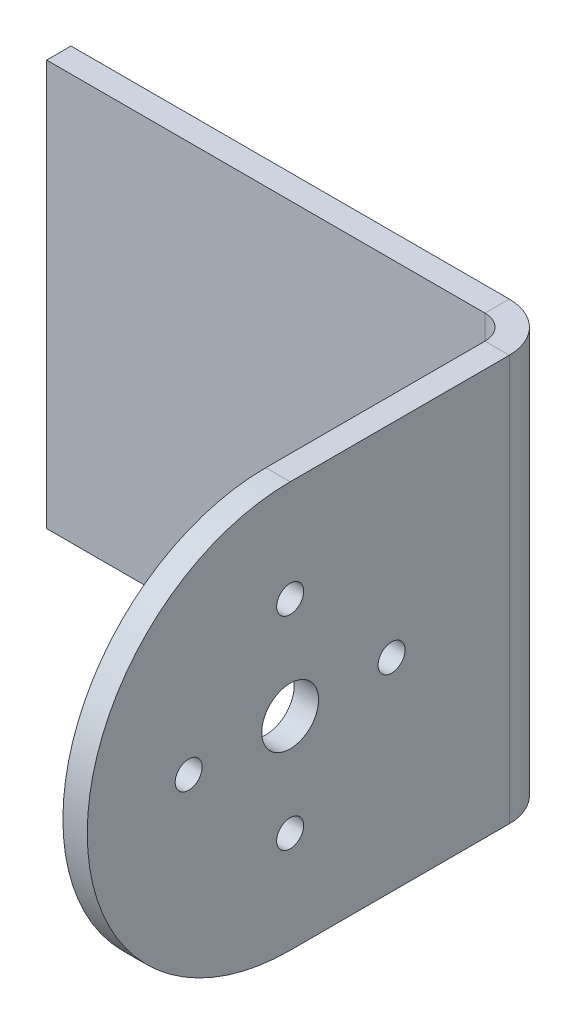
ISO-10303-21;
HEADER;
FILE_DESCRIPTION(('STEP AP214'),'2;1');
FILE_NAME('part.step','',(''),(''),'','','');
FILE_SCHEMA(('AUTOMOTIVE_DESIGN { 1 0 10303 214 1 1 1 1 }'));
ENDSEC;
DATA;
#1=APPLICATION_CONTEXT('core data for automotive mechanical design processes');
#2=APPLICATION_PROTOCOL_DEFINITION('international standard','automotive_design',2000,#1);
#3=PRODUCT_CONTEXT('',#1,'mechanical');
#4=PRODUCT('Part','Part','',(#3));
#5=PRODUCT_RELATED_PRODUCT_CATEGORY('part','',(#4));
#6=PRODUCT_DEFINITION_FORMATION('','',#4);
#7=PRODUCT_DEFINITION_CONTEXT('part definition',#1,'design');
#8=PRODUCT_DEFINITION('design','',#6,#7);
#9=PRODUCT_DEFINITION_SHAPE('','',#8);
#10=(LENGTH_UNIT() NAMED_UNIT(*) SI_UNIT(.MILLI.,.METRE.));
#11=(NAMED_UNIT(*) PLANE_ANGLE_UNIT() SI_UNIT($,.RADIAN.));
#12=(NAMED_UNIT(*) SI_UNIT($,.STERADIAN.) SOLID_ANGLE_UNIT());
#13=UNCERTAINTY_MEASURE_WITH_UNIT(LENGTH_MEASURE(1.E-05),#10,'distance_accuracy_value','');
#14=(GEOMETRIC_REPRESENTATION_CONTEXT(3) GLOBAL_UNCERTAINTY_ASSIGNED_CONTEXT((#13)) GLOBAL_UNIT_ASSIGNED_CONTEXT((#10,
#11,#12)) REPRESENTATION_CONTEXT('',''));
#15=CARTESIAN_POINT('',(0.,0.,0.));
#16=DIRECTION('',(0.,0.,1.));
#17=DIRECTION('',(1.,0.,0.));
#18=AXIS2_PLACEMENT_3D('',#15,#16,#17);
#19=CARTESIAN_POINT('',(30.0000000000002,25.,57.));
#20=DIRECTION('',(0.,-1.,0.));
#21=DIRECTION('',(0.,0.,-1.));
#22=AXIS2_PLACEMENT_3D('',#19,#20,#21);
#23=PLANE('',#22);
#24=DIRECTION('',(1.,0.,0.));
#25=VECTOR('',#24,1.);
#26=CARTESIAN_POINT('',(20.0000000000001,25.,30.));
#27=LINE('',#26,#25);
#28=CARTESIAN_POINT('',(27.0000000000001,25.,30.));
#29=VERTEX_POINT('',#28);
#30=CARTESIAN_POINT('',(30.0000000000001,25.,30.));
#31=VERTEX_POINT('',#30);
#32=EDGE_CURVE('E81',#29,#31,#27,.T.);
#33=ORIENTED_EDGE('',*,*,#32,.T.);
#34=DIRECTION('',(0.,0.,1.));
#35=VECTOR('',#34,1.);
#36=CARTESIAN_POINT('',(30.,25.,-1.14557852575138E-13));
#37=LINE('',#36,#35);
#38=CARTESIAN_POINT('',(30.,25.,2.99999999999998));
#39=VERTEX_POINT('',#38);
#40=EDGE_CURVE('E142',#39,#31,#37,.T.);
#41=ORIENTED_EDGE('',*,*,#40,.F.);
#42=DIRECTION('',(-1.,0.,0.));
#43=VECTOR('',#42,1.);
#44=CARTESIAN_POINT('',(27.,25.,2.99999999999999));
#45=LINE('',#44,#43);
#46=CARTESIAN_POINT('',(27.,25.,2.99999999999999));
#47=VERTEX_POINT('',#46);
#48=EDGE_CURVE('E158',#47,#39,#45,.F.);
#49=ORIENTED_EDGE('',*,*,#48,.F.);
#50=DIRECTION('',(0.,0.,-1.));
#51=VECTOR('',#50,1.);
#52=CARTESIAN_POINT('',(27.0000000000002,25.,57.));
#53=LINE('',#52,#51);
#54=EDGE_CURVE('E144',#47,#29,#53,.F.);
#55=ORIENTED_EDGE('',*,*,#54,.T.);
#56=EDGE_LOOP('',(#33,#41,#49,#55));
#57=FACE_BOUND('',#56,.T.);
#58=ADVANCED_FACE('F65',(#57),#23,.F.);
#59=CARTESIAN_POINT('',(30.,25.,-3.));
#60=DIRECTION('',(0.,1.,0.));
#61=DIRECTION('',(-1.,0.,0.));
#62=AXIS2_PLACEMENT_3D('',#59,#60,#61);
#63=PLANE('',#62);
#64=DIRECTION('',(-1.,0.,0.));
#65=VECTOR('',#64,1.);
#66=CARTESIAN_POINT('',(30.,25.,0.));
#67=LINE('',#66,#65);
#68=CARTESIAN_POINT('',(24.,25.,0.));
#69=VERTEX_POINT('',#68);
#70=CARTESIAN_POINT('',(-30.,25.,0.));
#71=VERTEX_POINT('',#70);
#72=EDGE_CURVE('E190',#69,#71,#67,.T.);
#73=ORIENTED_EDGE('',*,*,#72,.F.);
#74=DIRECTION('',(0.,0.,-1.));
#75=VECTOR('',#74,1.);
#76=CARTESIAN_POINT('',(24.,25.,0.));
#77=LINE('',#76,#75);
#78=CARTESIAN_POINT('',(24.,25.,-3.));
#79=VERTEX_POINT('',#78);
#80=EDGE_CURVE('E171',#69,#79,#77,.T.);
#81=ORIENTED_EDGE('',*,*,#80,.T.);
#82=DIRECTION('',(-1.,0.,0.));
#83=VECTOR('',#82,1.);
#84=CARTESIAN_POINT('',(30.,25.,-3.));
#85=LINE('',#84,#83);
#86=CARTESIAN_POINT('',(-30.,25.,-3.));
#87=VERTEX_POINT('',#86);
#88=EDGE_CURVE('E193',#79,#87,#85,.T.);
#89=ORIENTED_EDGE('',*,*,#88,.T.);
#90=DIRECTION('',(0.,0.,1.));
#91=VECTOR('',#90,1.);
#92=CARTESIAN_POINT('',(-30.,25.,-3.));
#93=LINE('',#92,#91);
#94=EDGE_CURVE('E74',#87,#71,#93,.T.);
#95=ORIENTED_EDGE('',*,*,#94,.T.);
#96=EDGE_LOOP('',(#73,#81,#89,#95));
#97=FACE_BOUND('',#96,.T.);
#98=ADVANCED_FACE('F281',(#97),#63,.T.);
#99=CARTESIAN_POINT('',(0.,0.,-3.));
#100=DIRECTION('',(0.,0.,-1.));
#101=DIRECTION('',(-1.,0.,0.));
#102=AXIS2_PLACEMENT_3D('',#99,#100,#101);
#103=PLANE('',#102);
#104=ORIENTED_EDGE('',*,*,#88,.F.);
#105=DIRECTION('',(0.,1.,0.));
#106=VECTOR('',#105,1.);
#107=CARTESIAN_POINT('',(24.,25.,-3.));
#108=LINE('',#107,#106);
#109=CARTESIAN_POINT('',(24.,-25.,-3.));
#110=VERTEX_POINT('',#109);
#111=EDGE_CURVE('E166',#79,#110,#108,.F.);
#112=ORIENTED_EDGE('',*,*,#111,.T.);
#113=DIRECTION('',(1.,0.,0.));
#114=VECTOR('',#113,1.);
#115=CARTESIAN_POINT('',(30.,-25.,-3.));
#116=LINE('',#115,#114);
#117=CARTESIAN_POINT('',(-30.,-25.,-3.));
#118=VERTEX_POINT('',#117);
#119=EDGE_CURVE('E189',#118,#110,#116,.T.);
#120=ORIENTED_EDGE('',*,*,#119,.F.);
#121=DIRECTION('',(0.,-1.,0.));
#122=VECTOR('',#121,1.);
#123=CARTESIAN_POINT('',(-30.,25.,-3.));
#124=LINE('',#123,#122);
#125=EDGE_CURVE('E186',#87,#118,#124,.T.);
#126=ORIENTED_EDGE('',*,*,#125,.F.);
#127=EDGE_LOOP('',(#104,#112,#120,#126));
#128=FACE_BOUND('',#127,.T.);
#129=ADVANCED_FACE('F288',(#128),#103,.T.);
#130=CARTESIAN_POINT('',(0.,0.,0.));
#131=DIRECTION('',(0.,0.,-1.));
#132=DIRECTION('',(-1.,0.,0.));
#133=AXIS2_PLACEMENT_3D('',#130,#131,#132);
#134=PLANE('',#133);
#135=DIRECTION('',(0.,1.,0.));
#136=VECTOR('',#135,1.);
#137=CARTESIAN_POINT('',(24.,25.,0.));
#138=LINE('',#137,#136);
#139=CARTESIAN_POINT('',(24.,-25.,0.));
#140=VERTEX_POINT('',#139);
#141=EDGE_CURVE('E177',#69,#140,#138,.F.);
#142=ORIENTED_EDGE('',*,*,#141,.F.);
#143=ORIENTED_EDGE('',*,*,#72,.T.);
#144=DIRECTION('',(0.,-1.,0.));
#145=VECTOR('',#144,1.);
#146=CARTESIAN_POINT('',(-30.,25.,0.));
#147=LINE('',#146,#145);
#148=CARTESIAN_POINT('',(-30.,-25.,0.));
#149=VERTEX_POINT('',#148);
#150=EDGE_CURVE('E183',#71,#149,#147,.T.);
#151=ORIENTED_EDGE('',*,*,#150,.T.);
#152=DIRECTION('',(1.,0.,0.));
#153=VECTOR('',#152,1.);
#154=CARTESIAN_POINT('',(30.,-25.,0.));
#155=LINE('',#154,#153);
#156=EDGE_CURVE('E198',#149,#140,#155,.T.);
#157=ORIENTED_EDGE('',*,*,#156,.T.);
#158=EDGE_LOOP('',(#142,#143,#151,#157));
#159=FACE_BOUND('',#158,.T.);
#160=ADVANCED_FACE('F310',(#159),#134,.F.);
#161=CARTESIAN_POINT('',(-30.,25.,-3.));
#162=DIRECTION('',(-1.,0.,0.));
#163=DIRECTION('',(0.,-1.,0.));
#164=AXIS2_PLACEMENT_3D('',#161,#162,#163);
#165=PLANE('',#164);
#166=ORIENTED_EDGE('',*,*,#150,.F.);
#167=ORIENTED_EDGE('',*,*,#94,.F.);
#168=ORIENTED_EDGE('',*,*,#125,.T.);
#169=DIRECTION('',(0.,0.,1.));
#170=VECTOR('',#169,1.);
#171=CARTESIAN_POINT('',(-30.,-25.,-3.));
#172=LINE('',#171,#170);
#173=EDGE_CURVE('E195',#118,#149,#172,.T.);
#174=ORIENTED_EDGE('',*,*,#173,.T.);
#175=EDGE_LOOP('',(#166,#167,#168,#174));
#176=FACE_BOUND('',#175,.T.);
#177=ADVANCED_FACE('F67',(#176),#165,.T.);
#178=CARTESIAN_POINT('',(30.,-25.,-3.));
#179=DIRECTION('',(0.,-1.,0.));
#180=DIRECTION('',(1.,0.,0.));
#181=AXIS2_PLACEMENT_3D('',#178,#179,#180);
#182=PLANE('',#181);
#183=DIRECTION('',(0.,0.,-1.));
#184=VECTOR('',#183,1.);
#185=CARTESIAN_POINT('',(24.,-25.,0.));
#186=LINE('',#185,#184);
#187=EDGE_CURVE('E181',#140,#110,#186,.T.);
#188=ORIENTED_EDGE('',*,*,#187,.F.);
#189=ORIENTED_EDGE('',*,*,#156,.F.);
#190=ORIENTED_EDGE('',*,*,#173,.F.);
#191=ORIENTED_EDGE('',*,*,#119,.T.);
#192=EDGE_LOOP('',(#188,#189,#190,#191));
#193=FACE_BOUND('',#192,.T.);
#194=ADVANCED_FACE('F303',(#193),#182,.T.);
#195=CARTESIAN_POINT('',(24.,-25.,3.));
#196=DIRECTION('',(0.,-1.,0.));
#197=DIRECTION('',(0.,0.,-1.));
#198=AXIS2_PLACEMENT_3D('',#195,#196,#197);
#199=PLANE('',#198);
#200=DIRECTION('',(-1.,0.,0.));
#201=VECTOR('',#200,1.);
#202=CARTESIAN_POINT('',(30.,-25.,2.99999999999998));
#203=LINE('',#202,#201);
#204=CARTESIAN_POINT('',(27.,-25.,2.99999999999999));
#205=VERTEX_POINT('',#204);
#206=CARTESIAN_POINT('',(30.,-25.,2.99999999999998));
#207=VERTEX_POINT('',#206);
#208=EDGE_CURVE('E163',#205,#207,#203,.F.);
#209=ORIENTED_EDGE('',*,*,#208,.F.);
#210=CARTESIAN_POINT('',(24.,-25.,3.));
#211=DIRECTION('',(0.,1.,0.));
#212=DIRECTION('',(0.,0.,1.));
#213=AXIS2_PLACEMENT_3D('',#210,#211,#212);
#214=CIRCLE('',#213,3.);
#215=EDGE_CURVE('E174',#140,#205,#214,.F.);
#216=ORIENTED_EDGE('',*,*,#215,.F.);
#217=ORIENTED_EDGE('',*,*,#187,.T.);
#218=CARTESIAN_POINT('',(24.,-25.,3.));
#219=DIRECTION('',(0.,1.,0.));
#220=DIRECTION('',(0.,0.,1.));
#221=AXIS2_PLACEMENT_3D('',#218,#219,#220);
#222=CIRCLE('',#221,6.);
#223=EDGE_CURVE('E89',#110,#207,#222,.F.);
#224=ORIENTED_EDGE('',*,*,#223,.T.);
#225=EDGE_LOOP('',(#209,#216,#217,#224));
#226=FACE_BOUND('',#225,.T.);
#227=ADVANCED_FACE('F300',(#226),#199,.T.);
#228=CARTESIAN_POINT('',(24.,25.,3.));
#229=DIRECTION('',(0.,-1.,0.));
#230=DIRECTION('',(0.,0.,-1.));
#231=AXIS2_PLACEMENT_3D('',#228,#229,#230);
#232=PLANE('',#231);
#233=CARTESIAN_POINT('',(24.,25.,3.));
#234=DIRECTION('',(0.,1.,0.));
#235=DIRECTION('',(0.,0.,1.));
#236=AXIS2_PLACEMENT_3D('',#233,#234,#235);
#237=CIRCLE('',#236,3.);
#238=EDGE_CURVE('E152',#47,#69,#237,.T.);
#239=ORIENTED_EDGE('',*,*,#238,.F.);
#240=ORIENTED_EDGE('',*,*,#48,.T.);
#241=CARTESIAN_POINT('',(24.,25.,3.));
#242=DIRECTION('',(0.,1.,0.));
#243=DIRECTION('',(0.,0.,1.));
#244=AXIS2_PLACEMENT_3D('',#241,#242,#243);
#245=CIRCLE('',#244,6.);
#246=EDGE_CURVE('E169',#39,#79,#245,.T.);
#247=ORIENTED_EDGE('',*,*,#246,.T.);
#248=ORIENTED_EDGE('',*,*,#80,.F.);
#249=EDGE_LOOP('',(#239,#240,#247,#248));
#250=FACE_BOUND('',#249,.T.);
#251=ADVANCED_FACE('F297',(#250),#232,.F.);
#252=CARTESIAN_POINT('',(24.,25.,3.));
#253=DIRECTION('',(0.,1.,0.));
#254=DIRECTION('',(1.,0.,0.));
#255=AXIS2_PLACEMENT_3D('',#252,#253,#254);
#256=CYLINDRICAL_SURFACE('',#255,6.);
#257=ORIENTED_EDGE('',*,*,#111,.F.);
#258=ORIENTED_EDGE('',*,*,#246,.F.);
#259=DIRECTION('',(0.,1.,0.));
#260=VECTOR('',#259,1.);
#261=CARTESIAN_POINT('',(30.,-25.,2.99999999999998));
#262=LINE('',#261,#260);
#263=EDGE_CURVE('E148',#39,#207,#262,.F.);
#264=ORIENTED_EDGE('',*,*,#263,.T.);
#265=ORIENTED_EDGE('',*,*,#223,.F.);
#266=EDGE_LOOP('',(#257,#258,#264,#265));
#267=FACE_BOUND('',#266,.T.);
#268=ADVANCED_FACE('F293',(#267),#256,.T.);
#269=CARTESIAN_POINT('',(24.,25.,3.));
#270=DIRECTION('',(0.,1.,0.));
#271=DIRECTION('',(1.,0.,0.));
#272=AXIS2_PLACEMENT_3D('',#269,#270,#271);
#273=CYLINDRICAL_SURFACE('',#272,3.);
#274=ORIENTED_EDGE('',*,*,#141,.T.);
#275=ORIENTED_EDGE('',*,*,#215,.T.);
#276=DIRECTION('',(0.,1.,0.));
#277=VECTOR('',#276,1.);
#278=CARTESIAN_POINT('',(27.,-25.,2.99999999999999));
#279=LINE('',#278,#277);
#280=EDGE_CURVE('E161',#205,#47,#279,.T.);
#281=ORIENTED_EDGE('',*,*,#280,.T.);
#282=ORIENTED_EDGE('',*,*,#238,.T.);
#283=EDGE_LOOP('',(#274,#275,#281,#282));
#284=FACE_BOUND('',#283,.T.);
#285=ADVANCED_FACE('F296',(#284),#273,.F.);
#286=CARTESIAN_POINT('',(30.,-25.,0.));
#287=DIRECTION('',(0.,1.,0.));
#288=DIRECTION('',(0.,0.,1.));
#289=AXIS2_PLACEMENT_3D('',#286,#287,#288);
#290=PLANE('',#289);
#291=DIRECTION('',(0.,0.,-1.));
#292=VECTOR('',#291,1.);
#293=CARTESIAN_POINT('',(30.,-25.,-1.14557852575138E-13));
#294=LINE('',#293,#292);
#295=CARTESIAN_POINT('',(30.0000000000001,-25.,30.));
#296=VERTEX_POINT('',#295);
#297=EDGE_CURVE('E149',#296,#207,#294,.T.);
#298=ORIENTED_EDGE('',*,*,#297,.F.);
#299=DIRECTION('',(1.,0.,0.));
#300=VECTOR('',#299,1.);
#301=CARTESIAN_POINT('',(20.0000000000001,-25.,30.));
#302=LINE('',#301,#300);
#303=CARTESIAN_POINT('',(27.0000000000002,-25.,30.));
#304=VERTEX_POINT('',#303);
#305=EDGE_CURVE('E133',#304,#296,#302,.T.);
#306=ORIENTED_EDGE('',*,*,#305,.F.);
#307=DIRECTION('',(0.,0.,1.));
#308=VECTOR('',#307,1.);
#309=CARTESIAN_POINT('',(27.,-25.,0.));
#310=LINE('',#309,#308);
#311=EDGE_CURVE('E150',#304,#205,#310,.F.);
#312=ORIENTED_EDGE('',*,*,#311,.T.);
#313=ORIENTED_EDGE('',*,*,#208,.T.);
#314=EDGE_LOOP('',(#298,#306,#312,#313));
#315=FACE_BOUND('',#314,.T.);
#316=ADVANCED_FACE('F238',(#315),#290,.F.);
#317=CARTESIAN_POINT('',(30.,0.,-1.14557852575138E-13));
#318=DIRECTION('',(-1.,0.,0.));
#319=DIRECTION('',(0.,0.,1.));
#320=AXIS2_PLACEMENT_3D('',#317,#318,#319);
#321=PLANE('',#320);
#322=CARTESIAN_POINT('',(30.0000000000001,12.5,30.));
#323=DIRECTION('',(1.,0.,0.));
#324=DIRECTION('',(0.,0.,-1.));
#325=AXIS2_PLACEMENT_3D('',#322,#323,#324);
#326=CIRCLE('',#325,1.665);
#327=CARTESIAN_POINT('',(30.0000000000001,12.5,28.335));
#328=VERTEX_POINT('',#327);
#329=EDGE_CURVE('E244',#328,#328,#326,.T.);
#330=ORIENTED_EDGE('',*,*,#329,.F.);
#331=EDGE_LOOP('',(#330));
#332=FACE_BOUND('',#331,.T.);
#333=CARTESIAN_POINT('',(30.0000000000002,0.,42.5));
#334=DIRECTION('',(1.,0.,0.));
#335=DIRECTION('',(0.,0.,-1.));
#336=AXIS2_PLACEMENT_3D('',#333,#334,#335);
#337=CIRCLE('',#336,1.665);
#338=CARTESIAN_POINT('',(30.0000000000002,0.,40.835));
#339=VERTEX_POINT('',#338);
#340=EDGE_CURVE('E245',#339,#339,#337,.T.);
#341=ORIENTED_EDGE('',*,*,#340,.F.);
#342=EDGE_LOOP('',(#341));
#343=FACE_BOUND('',#342,.T.);
#344=CARTESIAN_POINT('',(30.0000000000001,-12.5,30.));
#345=DIRECTION('',(1.,0.,0.));
#346=DIRECTION('',(0.,0.,1.));
#347=AXIS2_PLACEMENT_3D('',#344,#345,#346);
#348=CIRCLE('',#347,1.665);
#349=CARTESIAN_POINT('',(30.0000000000001,-12.5,31.665));
#350=VERTEX_POINT('',#349);
#351=EDGE_CURVE('E248',#350,#350,#348,.T.);
#352=ORIENTED_EDGE('',*,*,#351,.F.);
#353=EDGE_LOOP('',(#352));
#354=FACE_BOUND('',#353,.T.);
#355=CARTESIAN_POINT('',(30.0000000000001,0.,17.5));
#356=DIRECTION('',(1.,0.,0.));
#357=DIRECTION('',(0.,0.,1.));
#358=AXIS2_PLACEMENT_3D('',#355,#356,#357);
#359=CIRCLE('',#358,1.665);
#360=CARTESIAN_POINT('',(30.0000000000001,0.,19.165));
#361=VERTEX_POINT('',#360);
#362=EDGE_CURVE('E251',#361,#361,#359,.T.);
#363=ORIENTED_EDGE('',*,*,#362,.F.);
#364=EDGE_LOOP('',(#363));
#365=FACE_BOUND('',#364,.T.);
#366=CARTESIAN_POINT('',(30.0000000000001,0.,30.));
#367=DIRECTION('',(1.,0.,0.));
#368=DIRECTION('',(0.,0.,-1.));
#369=AXIS2_PLACEMENT_3D('',#366,#367,#368);
#370=CIRCLE('',#369,3.5);
#371=CARTESIAN_POINT('',(30.0000000000001,0.,26.5));
#372=VERTEX_POINT('',#371);
#373=EDGE_CURVE('E209',#372,#372,#370,.T.);
#374=ORIENTED_EDGE('',*,*,#373,.F.);
#375=EDGE_LOOP('',(#374));
#376=FACE_BOUND('',#375,.T.);
#377=ORIENTED_EDGE('',*,*,#40,.T.);
#378=CARTESIAN_POINT('',(30.0000000000001,0.,30.));
#379=DIRECTION('',(-1.,0.,0.));
#380=DIRECTION('',(0.,0.,-1.));
#381=AXIS2_PLACEMENT_3D('',#378,#379,#380);
#382=CIRCLE('',#381,25.);
#383=EDGE_CURVE('E130',#296,#31,#382,.T.);
#384=ORIENTED_EDGE('',*,*,#383,.F.);
#385=ORIENTED_EDGE('',*,*,#297,.T.);
#386=ORIENTED_EDGE('',*,*,#263,.F.);
#387=EDGE_LOOP('',(#377,#384,#385,#386));
#388=FACE_BOUND('',#387,.T.);
#389=ADVANCED_FACE('F147',(#332,#343,#354,#365,#376,#388),#321,.F.);
#390=CARTESIAN_POINT('',(27.,0.,-1.04083408558608E-13));
#391=DIRECTION('',(-1.,0.,0.));
#392=DIRECTION('',(0.,0.,1.));
#393=AXIS2_PLACEMENT_3D('',#390,#391,#392);
#394=PLANE('',#393);
#395=CARTESIAN_POINT('',(27.0000000000001,12.5,30.));
#396=DIRECTION('',(-1.,0.,0.));
#397=DIRECTION('',(0.,0.,1.));
#398=AXIS2_PLACEMENT_3D('',#395,#396,#397);
#399=CIRCLE('',#398,1.665);
#400=CARTESIAN_POINT('',(27.0000000000001,12.5,31.665));
#401=VERTEX_POINT('',#400);
#402=EDGE_CURVE('E69',#401,#401,#399,.T.);
#403=ORIENTED_EDGE('',*,*,#402,.F.);
#404=EDGE_LOOP('',(#403));
#405=FACE_BOUND('',#404,.T.);
#406=CARTESIAN_POINT('',(27.0000000000002,0.,42.5));
#407=DIRECTION('',(-1.,0.,0.));
#408=DIRECTION('',(0.,0.,1.));
#409=AXIS2_PLACEMENT_3D('',#406,#407,#408);
#410=CIRCLE('',#409,1.665);
#411=CARTESIAN_POINT('',(27.0000000000002,0.,44.165));
#412=VERTEX_POINT('',#411);
#413=EDGE_CURVE('E214',#412,#412,#410,.T.);
#414=ORIENTED_EDGE('',*,*,#413,.F.);
#415=EDGE_LOOP('',(#414));
#416=FACE_BOUND('',#415,.T.);
#417=CARTESIAN_POINT('',(27.0000000000001,-12.5,30.));
#418=DIRECTION('',(-1.,0.,0.));
#419=DIRECTION('',(0.,0.,1.));
#420=AXIS2_PLACEMENT_3D('',#417,#418,#419);
#421=CIRCLE('',#420,1.665);
#422=CARTESIAN_POINT('',(27.0000000000001,-12.5,31.665));
#423=VERTEX_POINT('',#422);
#424=EDGE_CURVE('E212',#423,#423,#421,.T.);
#425=ORIENTED_EDGE('',*,*,#424,.F.);
#426=EDGE_LOOP('',(#425));
#427=FACE_BOUND('',#426,.T.);
#428=CARTESIAN_POINT('',(27.0000000000001,0.,17.5));
#429=DIRECTION('',(-1.,0.,0.));
#430=DIRECTION('',(0.,0.,1.));
#431=AXIS2_PLACEMENT_3D('',#428,#429,#430);
#432=CIRCLE('',#431,1.665);
#433=CARTESIAN_POINT('',(27.0000000000001,0.,19.165));
#434=VERTEX_POINT('',#433);
#435=EDGE_CURVE('E208',#434,#434,#432,.T.);
#436=ORIENTED_EDGE('',*,*,#435,.F.);
#437=EDGE_LOOP('',(#436));
#438=FACE_BOUND('',#437,.T.);
#439=CARTESIAN_POINT('',(27.0000000000001,0.,30.));
#440=DIRECTION('',(-1.,0.,0.));
#441=DIRECTION('',(0.,0.,1.));
#442=AXIS2_PLACEMENT_3D('',#439,#440,#441);
#443=CIRCLE('',#442,3.5);
#444=CARTESIAN_POINT('',(27.0000000000001,0.,33.5));
#445=VERTEX_POINT('',#444);
#446=EDGE_CURVE('E205',#445,#445,#443,.T.);
#447=ORIENTED_EDGE('',*,*,#446,.F.);
#448=EDGE_LOOP('',(#447));
#449=FACE_BOUND('',#448,.T.);
#450=CARTESIAN_POINT('',(27.0000000000001,0.,30.));
#451=DIRECTION('',(-1.,0.,0.));
#452=DIRECTION('',(0.,0.,1.));
#453=AXIS2_PLACEMENT_3D('',#450,#451,#452);
#454=CIRCLE('',#453,25.);
#455=EDGE_CURVE('E13',#29,#304,#454,.F.);
#456=ORIENTED_EDGE('',*,*,#455,.F.);
#457=ORIENTED_EDGE('',*,*,#54,.F.);
#458=ORIENTED_EDGE('',*,*,#280,.F.);
#459=ORIENTED_EDGE('',*,*,#311,.F.);
#460=EDGE_LOOP('',(#456,#457,#458,#459));
#461=FACE_BOUND('',#460,.T.);
#462=ADVANCED_FACE('F224',(#405,#416,#427,#438,#449,#461),#394,.T.);
#463=CARTESIAN_POINT('',(20.0000000000001,0.,30.));
#464=DIRECTION('',(1.,0.,0.));
#465=DIRECTION('',(0.,0.,-1.));
#466=AXIS2_PLACEMENT_3D('',#463,#464,#465);
#467=CYLINDRICAL_SURFACE('',#466,25.);
#468=ORIENTED_EDGE('',*,*,#455,.T.);
#469=ORIENTED_EDGE('',*,*,#305,.T.);
#470=ORIENTED_EDGE('',*,*,#383,.T.);
#471=ORIENTED_EDGE('',*,*,#32,.F.);
#472=EDGE_LOOP('',(#468,#469,#470,#471));
#473=FACE_BOUND('',#472,.T.);
#474=ADVANCED_FACE('F131',(#473),#467,.T.);
#475=CARTESIAN_POINT('',(20.0000000000001,0.,30.));
#476=DIRECTION('',(1.,0.,0.));
#477=DIRECTION('',(0.,0.,-1.));
#478=AXIS2_PLACEMENT_3D('',#475,#476,#477);
#479=CYLINDRICAL_SURFACE('',#478,3.5);
#480=ORIENTED_EDGE('',*,*,#446,.T.);
#481=EDGE_LOOP('',(#480));
#482=FACE_BOUND('',#481,.T.);
#483=ORIENTED_EDGE('',*,*,#373,.T.);
#484=EDGE_LOOP('',(#483));
#485=FACE_BOUND('',#484,.T.);
#486=ADVANCED_FACE('F267',(#482,#485),#479,.F.);
#487=CARTESIAN_POINT('',(20.0000000000001,0.,17.5));
#488=DIRECTION('',(1.,0.,0.));
#489=DIRECTION('',(0.,0.,-1.));
#490=AXIS2_PLACEMENT_3D('',#487,#488,#489);
#491=CYLINDRICAL_SURFACE('',#490,1.665);
#492=ORIENTED_EDGE('',*,*,#435,.T.);
#493=EDGE_LOOP('',(#492));
#494=FACE_BOUND('',#493,.T.);
#495=ORIENTED_EDGE('',*,*,#362,.T.);
#496=EDGE_LOOP('',(#495));
#497=FACE_BOUND('',#496,.T.);
#498=ADVANCED_FACE('F269',(#494,#497),#491,.F.);
#499=CARTESIAN_POINT('',(20.0000000000001,-12.5,30.));
#500=DIRECTION('',(1.,0.,0.));
#501=DIRECTION('',(0.,0.,-1.));
#502=AXIS2_PLACEMENT_3D('',#499,#500,#501);
#503=CYLINDRICAL_SURFACE('',#502,1.665);
#504=ORIENTED_EDGE('',*,*,#424,.T.);
#505=EDGE_LOOP('',(#504));
#506=FACE_BOUND('',#505,.T.);
#507=ORIENTED_EDGE('',*,*,#351,.T.);
#508=EDGE_LOOP('',(#507));
#509=FACE_BOUND('',#508,.T.);
#510=ADVANCED_FACE('F257',(#506,#509),#503,.F.);
#511=CARTESIAN_POINT('',(20.0000000000002,0.,42.5));
#512=DIRECTION('',(1.,0.,0.));
#513=DIRECTION('',(0.,0.,-1.));
#514=AXIS2_PLACEMENT_3D('',#511,#512,#513);
#515=CYLINDRICAL_SURFACE('',#514,1.665);
#516=ORIENTED_EDGE('',*,*,#413,.T.);
#517=EDGE_LOOP('',(#516));
#518=FACE_BOUND('',#517,.T.);
#519=ORIENTED_EDGE('',*,*,#340,.T.);
#520=EDGE_LOOP('',(#519));
#521=FACE_BOUND('',#520,.T.);
#522=ADVANCED_FACE('F448',(#518,#521),#515,.F.);
#523=CARTESIAN_POINT('',(20.0000000000001,12.5,30.));
#524=DIRECTION('',(1.,0.,0.));
#525=DIRECTION('',(0.,0.,-1.));
#526=AXIS2_PLACEMENT_3D('',#523,#524,#525);
#527=CYLINDRICAL_SURFACE('',#526,1.665);
#528=ORIENTED_EDGE('',*,*,#402,.T.);
#529=EDGE_LOOP('',(#528));
#530=FACE_BOUND('',#529,.T.);
#531=ORIENTED_EDGE('',*,*,#329,.T.);
#532=EDGE_LOOP('',(#531));
#533=FACE_BOUND('',#532,.T.);
#534=ADVANCED_FACE('F221',(#530,#533),#527,.F.);
#535=CLOSED_SHELL('',(#58,#98,#129,#160,#177,#194,#227,#251,#268,#285,#316,#389,#462,#474,#486,
#498,#510,#522,#534));
#536=MANIFOLD_SOLID_BREP('B2',#535);
#537=ADVANCED_BREP_SHAPE_REPRESENTATION('',(#18,#536),#14);
#538=SHAPE_DEFINITION_REPRESENTATION(#9,#537);
ENDSEC;
END-ISO-10303-21;
